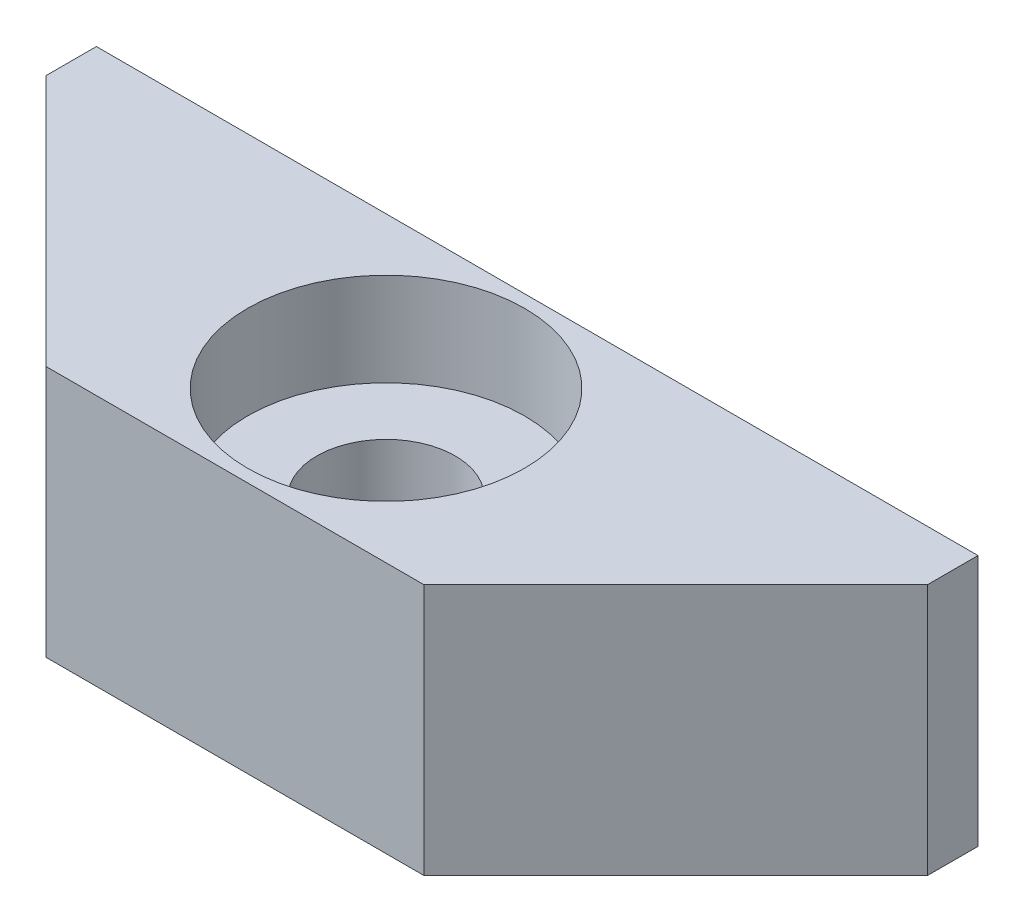
ISO-10303-21;
HEADER;
FILE_DESCRIPTION(('STEP AP214'),'2;1');
FILE_NAME('part.step','',(''),(''),'','','');
FILE_SCHEMA(('AUTOMOTIVE_DESIGN { 1 0 10303 214 1 1 1 1 }'));
ENDSEC;
DATA;
#1=APPLICATION_CONTEXT('core data for automotive mechanical design processes');
#2=APPLICATION_PROTOCOL_DEFINITION('international standard','automotive_design',2000,#1);
#3=PRODUCT_CONTEXT('',#1,'mechanical');
#4=PRODUCT('Part','Part','',(#3));
#5=PRODUCT_RELATED_PRODUCT_CATEGORY('part','',(#4));
#6=PRODUCT_DEFINITION_FORMATION('','',#4);
#7=PRODUCT_DEFINITION_CONTEXT('part definition',#1,'design');
#8=PRODUCT_DEFINITION('design','',#6,#7);
#9=PRODUCT_DEFINITION_SHAPE('','',#8);
#10=(LENGTH_UNIT() NAMED_UNIT(*) SI_UNIT(.MILLI.,.METRE.));
#11=(NAMED_UNIT(*) PLANE_ANGLE_UNIT() SI_UNIT($,.RADIAN.));
#12=(NAMED_UNIT(*) SI_UNIT($,.STERADIAN.) SOLID_ANGLE_UNIT());
#13=UNCERTAINTY_MEASURE_WITH_UNIT(LENGTH_MEASURE(1.E-05),#10,'distance_accuracy_value','');
#14=(GEOMETRIC_REPRESENTATION_CONTEXT(3) GLOBAL_UNCERTAINTY_ASSIGNED_CONTEXT((#13)) GLOBAL_UNIT_ASSIGNED_CONTEXT((#10,
#11,#12)) REPRESENTATION_CONTEXT('',''));
#15=CARTESIAN_POINT('',(0.,0.,0.));
#16=DIRECTION('',(0.,0.,1.));
#17=DIRECTION('',(1.,0.,0.));
#18=AXIS2_PLACEMENT_3D('',#15,#16,#17);
#19=CARTESIAN_POINT('',(0.,10.,0.));
#20=DIRECTION('',(0.,1.,0.));
#21=DIRECTION('',(0.,0.,1.));
#22=AXIS2_PLACEMENT_3D('',#19,#20,#21);
#23=CYLINDRICAL_SURFACE('',#22,2.75);
#24=CARTESIAN_POINT('',(0.,6.3,0.));
#25=DIRECTION('',(0.,1.,0.));
#26=DIRECTION('',(0.,0.,1.));
#27=AXIS2_PLACEMENT_3D('',#24,#25,#26);
#28=CIRCLE('',#27,2.75);
#29=CARTESIAN_POINT('',(0.,6.3,2.75));
#30=VERTEX_POINT('',#29);
#31=EDGE_CURVE('E110',#30,#30,#28,.T.);
#32=ORIENTED_EDGE('',*,*,#31,.T.);
#33=EDGE_LOOP('',(#32));
#34=FACE_BOUND('',#33,.T.);
#35=CARTESIAN_POINT('',(0.,3.,0.));
#36=DIRECTION('',(0.,-1.,0.));
#37=DIRECTION('',(0.,0.,-1.));
#38=AXIS2_PLACEMENT_3D('',#35,#36,#37);
#39=CIRCLE('',#38,2.75);
#40=CARTESIAN_POINT('',(0.,3.,-2.75));
#41=VERTEX_POINT('',#40);
#42=EDGE_CURVE('E101',#41,#41,#39,.F.);
#43=ORIENTED_EDGE('',*,*,#42,.F.);
#44=EDGE_LOOP('',(#43));
#45=FACE_BOUND('',#44,.T.);
#46=ADVANCED_FACE('F17',(#34,#45),#23,.F.);
#47=CARTESIAN_POINT('',(17.5,10.,6.));
#48=DIRECTION('',(-1.,0.,0.));
#49=DIRECTION('',(0.,0.,1.));
#50=AXIS2_PLACEMENT_3D('',#47,#48,#49);
#51=PLANE('',#50);
#52=DIRECTION('',(0.,0.,-1.));
#53=VECTOR('',#52,1.);
#54=CARTESIAN_POINT('',(17.5,10.,6.));
#55=LINE('',#54,#53);
#56=CARTESIAN_POINT('',(17.5,10.,-4.));
#57=VERTEX_POINT('',#56);
#58=CARTESIAN_POINT('',(17.5,10.,-6.));
#59=VERTEX_POINT('',#58);
#60=EDGE_CURVE('E114',#57,#59,#55,.T.);
#61=ORIENTED_EDGE('',*,*,#60,.F.);
#62=DIRECTION('',(0.,-1.,0.));
#63=VECTOR('',#62,1.);
#64=CARTESIAN_POINT('',(17.5,10.,-4.));
#65=LINE('',#64,#63);
#66=CARTESIAN_POINT('',(17.5,0.,-4.));
#67=VERTEX_POINT('',#66);
#68=EDGE_CURVE('E135',#57,#67,#65,.T.);
#69=ORIENTED_EDGE('',*,*,#68,.T.);
#70=DIRECTION('',(0.,0.,-1.));
#71=VECTOR('',#70,1.);
#72=CARTESIAN_POINT('',(17.5,0.,6.));
#73=LINE('',#72,#71);
#74=CARTESIAN_POINT('',(17.5,0.,-6.));
#75=VERTEX_POINT('',#74);
#76=EDGE_CURVE('E113',#67,#75,#73,.T.);
#77=ORIENTED_EDGE('',*,*,#76,.T.);
#78=DIRECTION('',(0.,-1.,0.));
#79=VECTOR('',#78,1.);
#80=CARTESIAN_POINT('',(17.5,10.,-6.));
#81=LINE('',#80,#79);
#82=EDGE_CURVE('E132',#59,#75,#81,.T.);
#83=ORIENTED_EDGE('',*,*,#82,.F.);
#84=EDGE_LOOP('',(#61,#69,#77,#83));
#85=FACE_BOUND('',#84,.T.);
#86=ADVANCED_FACE('F158',(#85),#51,.F.);
#87=CARTESIAN_POINT('',(-17.5,10.,-6.));
#88=DIRECTION('',(0.,0.,1.));
#89=DIRECTION('',(1.,0.,0.));
#90=AXIS2_PLACEMENT_3D('',#87,#88,#89);
#91=PLANE('',#90);
#92=CARTESIAN_POINT('',(12.5,5.,-6.));
#93=DIRECTION('',(0.,0.,-1.));
#94=DIRECTION('',(-1.,0.,0.));
#95=AXIS2_PLACEMENT_3D('',#92,#93,#94);
#96=CIRCLE('',#95,1.65);
#97=CARTESIAN_POINT('',(10.85,5.,-6.));
#98=VERTEX_POINT('',#97);
#99=EDGE_CURVE('E87',#98,#98,#96,.T.);
#100=ORIENTED_EDGE('',*,*,#99,.F.);
#101=EDGE_LOOP('',(#100));
#102=FACE_BOUND('',#101,.T.);
#103=CARTESIAN_POINT('',(-12.5,5.,-6.));
#104=DIRECTION('',(0.,0.,-1.));
#105=DIRECTION('',(-1.,0.,0.));
#106=AXIS2_PLACEMENT_3D('',#103,#104,#105);
#107=CIRCLE('',#106,1.65);
#108=CARTESIAN_POINT('',(-14.15,5.,-6.));
#109=VERTEX_POINT('',#108);
#110=EDGE_CURVE('E86',#109,#109,#107,.T.);
#111=ORIENTED_EDGE('',*,*,#110,.F.);
#112=EDGE_LOOP('',(#111));
#113=FACE_BOUND('',#112,.T.);
#114=DIRECTION('',(-1.,0.,0.));
#115=VECTOR('',#114,1.);
#116=CARTESIAN_POINT('',(-17.5,0.,-6.));
#117=LINE('',#116,#115);
#118=CARTESIAN_POINT('',(-17.5,0.,-6.));
#119=VERTEX_POINT('',#118);
#120=EDGE_CURVE('E125',#75,#119,#117,.T.);
#121=ORIENTED_EDGE('',*,*,#120,.T.);
#122=DIRECTION('',(0.,-1.,0.));
#123=VECTOR('',#122,1.);
#124=CARTESIAN_POINT('',(-17.5,10.,-6.));
#125=LINE('',#124,#123);
#126=CARTESIAN_POINT('',(-17.5,10.,-6.));
#127=VERTEX_POINT('',#126);
#128=EDGE_CURVE('E123',#127,#119,#125,.T.);
#129=ORIENTED_EDGE('',*,*,#128,.F.);
#130=DIRECTION('',(-1.,0.,0.));
#131=VECTOR('',#130,1.);
#132=CARTESIAN_POINT('',(-17.5,10.,-6.));
#133=LINE('',#132,#131);
#134=EDGE_CURVE('E116',#59,#127,#133,.T.);
#135=ORIENTED_EDGE('',*,*,#134,.F.);
#136=ORIENTED_EDGE('',*,*,#82,.T.);
#137=EDGE_LOOP('',(#121,#129,#135,#136));
#138=FACE_BOUND('',#137,.T.);
#139=ADVANCED_FACE('F173',(#102,#113,#138),#91,.F.);
#140=CARTESIAN_POINT('',(-17.5,10.,6.));
#141=DIRECTION('',(1.,0.,0.));
#142=DIRECTION('',(0.,0.,-1.));
#143=AXIS2_PLACEMENT_3D('',#140,#141,#142);
#144=PLANE('',#143);
#145=DIRECTION('',(0.,0.,1.));
#146=VECTOR('',#145,1.);
#147=CARTESIAN_POINT('',(-17.5,0.,6.));
#148=LINE('',#147,#146);
#149=CARTESIAN_POINT('',(-17.5,0.,-4.00000000000005));
#150=VERTEX_POINT('',#149);
#151=EDGE_CURVE('E127',#119,#150,#148,.T.);
#152=ORIENTED_EDGE('',*,*,#151,.T.);
#153=DIRECTION('',(0.,1.,0.));
#154=VECTOR('',#153,1.);
#155=CARTESIAN_POINT('',(-17.5,10.,-4.00000000000005));
#156=LINE('',#155,#154);
#157=CARTESIAN_POINT('',(-17.5,10.,-4.00000000000005));
#158=VERTEX_POINT('',#157);
#159=EDGE_CURVE('E11',#150,#158,#156,.T.);
#160=ORIENTED_EDGE('',*,*,#159,.T.);
#161=DIRECTION('',(0.,0.,1.));
#162=VECTOR('',#161,1.);
#163=CARTESIAN_POINT('',(-17.5,10.,6.));
#164=LINE('',#163,#162);
#165=EDGE_CURVE('E119',#127,#158,#164,.T.);
#166=ORIENTED_EDGE('',*,*,#165,.F.);
#167=ORIENTED_EDGE('',*,*,#128,.T.);
#168=EDGE_LOOP('',(#152,#160,#166,#167));
#169=FACE_BOUND('',#168,.T.);
#170=ADVANCED_FACE('F170',(#169),#144,.F.);
#171=CARTESIAN_POINT('',(-17.5,10.,6.));
#172=DIRECTION('',(0.,0.,-1.));
#173=DIRECTION('',(-1.,0.,0.));
#174=AXIS2_PLACEMENT_3D('',#171,#172,#173);
#175=PLANE('',#174);
#176=DIRECTION('',(1.,0.,0.));
#177=VECTOR('',#176,1.);
#178=CARTESIAN_POINT('',(-17.5,0.,6.));
#179=LINE('',#178,#177);
#180=CARTESIAN_POINT('',(-7.5,0.,6.));
#181=VERTEX_POINT('',#180);
#182=CARTESIAN_POINT('',(7.5,0.,6.));
#183=VERTEX_POINT('',#182);
#184=EDGE_CURVE('E117',#181,#183,#179,.T.);
#185=ORIENTED_EDGE('',*,*,#184,.T.);
#186=DIRECTION('',(0.,1.,0.));
#187=VECTOR('',#186,1.);
#188=CARTESIAN_POINT('',(7.5,10.,6.));
#189=LINE('',#188,#187);
#190=CARTESIAN_POINT('',(7.5,10.,6.));
#191=VERTEX_POINT('',#190);
#192=EDGE_CURVE('E38',#183,#191,#189,.T.);
#193=ORIENTED_EDGE('',*,*,#192,.T.);
#194=DIRECTION('',(1.,0.,0.));
#195=VECTOR('',#194,1.);
#196=CARTESIAN_POINT('',(-17.5,10.,6.));
#197=LINE('',#196,#195);
#198=CARTESIAN_POINT('',(-7.5,10.,6.));
#199=VERTEX_POINT('',#198);
#200=EDGE_CURVE('E121',#199,#191,#197,.T.);
#201=ORIENTED_EDGE('',*,*,#200,.F.);
#202=DIRECTION('',(0.,-1.,0.));
#203=VECTOR('',#202,1.);
#204=CARTESIAN_POINT('',(-7.5,10.,6.));
#205=LINE('',#204,#203);
#206=EDGE_CURVE('E144',#199,#181,#205,.T.);
#207=ORIENTED_EDGE('',*,*,#206,.T.);
#208=EDGE_LOOP('',(#185,#193,#201,#207));
#209=FACE_BOUND('',#208,.T.);
#210=ADVANCED_FACE('F165',(#209),#175,.F.);
#211=CARTESIAN_POINT('',(17.5,10.,-6.));
#212=DIRECTION('',(0.,-1.,0.));
#213=DIRECTION('',(0.,0.,-1.));
#214=AXIS2_PLACEMENT_3D('',#211,#212,#213);
#215=PLANE('',#214);
#216=CARTESIAN_POINT('',(0.,10.,0.));
#217=DIRECTION('',(0.,1.,0.));
#218=DIRECTION('',(0.,0.,1.));
#219=AXIS2_PLACEMENT_3D('',#216,#217,#218);
#220=CIRCLE('',#219,5.5);
#221=CARTESIAN_POINT('',(0.,10.,5.5));
#222=VERTEX_POINT('',#221);
#223=EDGE_CURVE('E104',#222,#222,#220,.T.);
#224=ORIENTED_EDGE('',*,*,#223,.F.);
#225=EDGE_LOOP('',(#224));
#226=FACE_BOUND('',#225,.T.);
#227=ORIENTED_EDGE('',*,*,#200,.T.);
#228=DIRECTION('',(-0.707106781186549,0.,0.707106781186547));
#229=VECTOR('',#228,1.);
#230=CARTESIAN_POINT('',(17.5,10.,-4.));
#231=LINE('',#230,#229);
#232=EDGE_CURVE('E25',#191,#57,#231,.F.);
#233=ORIENTED_EDGE('',*,*,#232,.T.);
#234=ORIENTED_EDGE('',*,*,#60,.T.);
#235=ORIENTED_EDGE('',*,*,#134,.T.);
#236=ORIENTED_EDGE('',*,*,#165,.T.);
#237=DIRECTION('',(-0.707106781186547,0.,-0.707106781186549));
#238=VECTOR('',#237,1.);
#239=CARTESIAN_POINT('',(-7.5,10.,6.));
#240=LINE('',#239,#238);
#241=EDGE_CURVE('E148',#158,#199,#240,.F.);
#242=ORIENTED_EDGE('',*,*,#241,.T.);
#243=EDGE_LOOP('',(#227,#233,#234,#235,#236,#242));
#244=FACE_BOUND('',#243,.T.);
#245=ADVANCED_FACE('F152',(#226,#244),#215,.F.);
#246=CARTESIAN_POINT('',(17.5,0.,-6.));
#247=DIRECTION('',(0.,-1.,0.));
#248=DIRECTION('',(0.,0.,-1.));
#249=AXIS2_PLACEMENT_3D('',#246,#247,#248);
#250=PLANE('',#249);
#251=CARTESIAN_POINT('',(0.,0.,0.));
#252=DIRECTION('',(0.,-1.,0.));
#253=DIRECTION('',(0.,0.,-1.));
#254=AXIS2_PLACEMENT_3D('',#251,#252,#253);
#255=CIRCLE('',#254,4.);
#256=CARTESIAN_POINT('',(0.,0.,-4.));
#257=VERTEX_POINT('',#256);
#258=EDGE_CURVE('E97',#257,#257,#255,.T.);
#259=ORIENTED_EDGE('',*,*,#258,.F.);
#260=EDGE_LOOP('',(#259));
#261=FACE_BOUND('',#260,.T.);
#262=ORIENTED_EDGE('',*,*,#76,.F.);
#263=DIRECTION('',(0.707106781186549,0.,-0.707106781186547));
#264=VECTOR('',#263,1.);
#265=CARTESIAN_POINT('',(18.5,0.,-5.));
#266=LINE('',#265,#264);
#267=EDGE_CURVE('E142',#67,#183,#266,.F.);
#268=ORIENTED_EDGE('',*,*,#267,.T.);
#269=ORIENTED_EDGE('',*,*,#184,.F.);
#270=DIRECTION('',(0.707106781186547,0.,0.707106781186549));
#271=VECTOR('',#270,1.);
#272=CARTESIAN_POINT('',(-1.00000000000001,0.,12.5));
#273=LINE('',#272,#271);
#274=EDGE_CURVE('E140',#181,#150,#273,.F.);
#275=ORIENTED_EDGE('',*,*,#274,.T.);
#276=ORIENTED_EDGE('',*,*,#151,.F.);
#277=ORIENTED_EDGE('',*,*,#120,.F.);
#278=EDGE_LOOP('',(#262,#268,#269,#275,#276,#277));
#279=FACE_BOUND('',#278,.T.);
#280=ADVANCED_FACE('F163',(#261,#279),#250,.T.);
#281=CARTESIAN_POINT('',(2.75,6.3,0.));
#282=DIRECTION('',(0.,-1.,0.));
#283=DIRECTION('',(0.,0.,-1.));
#284=AXIS2_PLACEMENT_3D('',#281,#282,#283);
#285=PLANE('',#284);
#286=ORIENTED_EDGE('',*,*,#31,.F.);
#287=EDGE_LOOP('',(#286));
#288=FACE_BOUND('',#287,.T.);
#289=CARTESIAN_POINT('',(0.,6.3,0.));
#290=DIRECTION('',(0.,1.,0.));
#291=DIRECTION('',(0.,0.,1.));
#292=AXIS2_PLACEMENT_3D('',#289,#290,#291);
#293=CIRCLE('',#292,5.5);
#294=CARTESIAN_POINT('',(0.,6.3,5.5));
#295=VERTEX_POINT('',#294);
#296=EDGE_CURVE('E107',#295,#295,#293,.T.);
#297=ORIENTED_EDGE('',*,*,#296,.T.);
#298=EDGE_LOOP('',(#297));
#299=FACE_BOUND('',#298,.T.);
#300=ADVANCED_FACE('F196',(#288,#299),#285,.F.);
#301=CARTESIAN_POINT('',(0.,10.,0.));
#302=DIRECTION('',(0.,1.,0.));
#303=DIRECTION('',(0.,0.,1.));
#304=AXIS2_PLACEMENT_3D('',#301,#302,#303);
#305=CYLINDRICAL_SURFACE('',#304,5.5);
#306=ORIENTED_EDGE('',*,*,#296,.F.);
#307=EDGE_LOOP('',(#306));
#308=FACE_BOUND('',#307,.T.);
#309=ORIENTED_EDGE('',*,*,#223,.T.);
#310=EDGE_LOOP('',(#309));
#311=FACE_BOUND('',#310,.T.);
#312=ADVANCED_FACE('F231',(#308,#311),#305,.F.);
#313=CARTESIAN_POINT('',(0.,3.,0.));
#314=DIRECTION('',(0.,-1.,0.));
#315=DIRECTION('',(0.,0.,-1.));
#316=AXIS2_PLACEMENT_3D('',#313,#314,#315);
#317=PLANE('',#316);
#318=CARTESIAN_POINT('',(0.,3.,0.));
#319=DIRECTION('',(0.,-1.,0.));
#320=DIRECTION('',(0.,0.,-1.));
#321=AXIS2_PLACEMENT_3D('',#318,#319,#320);
#322=CIRCLE('',#321,4.);
#323=CARTESIAN_POINT('',(0.,3.,-4.));
#324=VERTEX_POINT('',#323);
#325=EDGE_CURVE('E98',#324,#324,#322,.T.);
#326=ORIENTED_EDGE('',*,*,#325,.T.);
#327=EDGE_LOOP('',(#326));
#328=FACE_BOUND('',#327,.T.);
#329=ORIENTED_EDGE('',*,*,#42,.T.);
#330=EDGE_LOOP('',(#329));
#331=FACE_BOUND('',#330,.T.);
#332=ADVANCED_FACE('F239',(#328,#331),#317,.T.);
#333=CARTESIAN_POINT('',(0.,3.,0.));
#334=DIRECTION('',(0.,-1.,0.));
#335=DIRECTION('',(0.,0.,-1.));
#336=AXIS2_PLACEMENT_3D('',#333,#334,#335);
#337=CYLINDRICAL_SURFACE('',#336,4.);
#338=ORIENTED_EDGE('',*,*,#325,.F.);
#339=EDGE_LOOP('',(#338));
#340=FACE_BOUND('',#339,.T.);
#341=ORIENTED_EDGE('',*,*,#258,.T.);
#342=EDGE_LOOP('',(#341));
#343=FACE_BOUND('',#342,.T.);
#344=ADVANCED_FACE('F247',(#340,#343),#337,.F.);
#345=CARTESIAN_POINT('',(17.5,10.,-4.));
#346=DIRECTION('',(-0.707106781186547,0.,-0.707106781186549));
#347=DIRECTION('',(-0.707106781186549,0.,0.707106781186547));
#348=AXIS2_PLACEMENT_3D('',#345,#346,#347);
#349=PLANE('',#348);
#350=ORIENTED_EDGE('',*,*,#232,.F.);
#351=ORIENTED_EDGE('',*,*,#192,.F.);
#352=ORIENTED_EDGE('',*,*,#267,.F.);
#353=ORIENTED_EDGE('',*,*,#68,.F.);
#354=EDGE_LOOP('',(#350,#351,#352,#353));
#355=FACE_BOUND('',#354,.T.);
#356=ADVANCED_FACE('F160',(#355),#349,.F.);
#357=CARTESIAN_POINT('',(-7.5,10.,6.));
#358=DIRECTION('',(0.707106781186549,0.,-0.707106781186547));
#359=DIRECTION('',(-0.707106781186547,0.,-0.707106781186549));
#360=AXIS2_PLACEMENT_3D('',#357,#358,#359);
#361=PLANE('',#360);
#362=ORIENTED_EDGE('',*,*,#241,.F.);
#363=ORIENTED_EDGE('',*,*,#159,.F.);
#364=ORIENTED_EDGE('',*,*,#274,.F.);
#365=ORIENTED_EDGE('',*,*,#206,.F.);
#366=EDGE_LOOP('',(#362,#363,#364,#365));
#367=FACE_BOUND('',#366,.T.);
#368=ADVANCED_FACE('F19',(#367),#361,.F.);
#369=CARTESIAN_POINT('',(-12.5,5.,-1.));
#370=DIRECTION('',(0.,0.,-1.));
#371=DIRECTION('',(-1.,0.,0.));
#372=AXIS2_PLACEMENT_3D('',#369,#370,#371);
#373=CONICAL_SURFACE('',#372,1.65,1.02974425867665);
#374=CARTESIAN_POINT('',(-12.5,5.,-0.00857997860453062));
#375=VERTEX_POINT('',#374);
#376=VERTEX_LOOP('',#375);
#377=FACE_BOUND('',#376,.T.);
#378=CARTESIAN_POINT('',(-12.5,5.,-1.));
#379=DIRECTION('',(0.,0.,-1.));
#380=DIRECTION('',(-1.,0.,0.));
#381=AXIS2_PLACEMENT_3D('',#378,#379,#380);
#382=CIRCLE('',#381,1.65);
#383=CARTESIAN_POINT('',(-14.15,5.,-1.));
#384=VERTEX_POINT('',#383);
#385=EDGE_CURVE('E90',#384,#384,#382,.T.);
#386=ORIENTED_EDGE('',*,*,#385,.T.);
#387=EDGE_LOOP('',(#386));
#388=FACE_BOUND('',#387,.T.);
#389=ADVANCED_FACE('F270',(#377,#388),#373,.F.);
#390=CARTESIAN_POINT('',(-12.5,5.,-6.));
#391=DIRECTION('',(0.,0.,-1.));
#392=DIRECTION('',(-1.,0.,0.));
#393=AXIS2_PLACEMENT_3D('',#390,#391,#392);
#394=CYLINDRICAL_SURFACE('',#393,1.65);
#395=ORIENTED_EDGE('',*,*,#385,.F.);
#396=EDGE_LOOP('',(#395));
#397=FACE_BOUND('',#396,.T.);
#398=ORIENTED_EDGE('',*,*,#110,.T.);
#399=EDGE_LOOP('',(#398));
#400=FACE_BOUND('',#399,.T.);
#401=ADVANCED_FACE('F80',(#397,#400),#394,.F.);
#402=CARTESIAN_POINT('',(12.5,5.,-1.));
#403=DIRECTION('',(0.,0.,-1.));
#404=DIRECTION('',(-1.,0.,0.));
#405=AXIS2_PLACEMENT_3D('',#402,#403,#404);
#406=CONICAL_SURFACE('',#405,1.65,1.02974425867665);
#407=CARTESIAN_POINT('',(12.5,5.,-0.00857997860453062));
#408=VERTEX_POINT('',#407);
#409=VERTEX_LOOP('',#408);
#410=FACE_BOUND('',#409,.T.);
#411=CARTESIAN_POINT('',(12.5,5.,-1.));
#412=DIRECTION('',(0.,0.,-1.));
#413=DIRECTION('',(-1.,0.,0.));
#414=AXIS2_PLACEMENT_3D('',#411,#412,#413);
#415=CIRCLE('',#414,1.65);
#416=CARTESIAN_POINT('',(10.85,5.,-1.));
#417=VERTEX_POINT('',#416);
#418=EDGE_CURVE('E84',#417,#417,#415,.T.);
#419=ORIENTED_EDGE('',*,*,#418,.T.);
#420=EDGE_LOOP('',(#419));
#421=FACE_BOUND('',#420,.T.);
#422=ADVANCED_FACE('F76',(#410,#421),#406,.F.);
#423=CARTESIAN_POINT('',(12.5,5.,-6.));
#424=DIRECTION('',(0.,0.,-1.));
#425=DIRECTION('',(-1.,0.,0.));
#426=AXIS2_PLACEMENT_3D('',#423,#424,#425);
#427=CYLINDRICAL_SURFACE('',#426,1.65);
#428=ORIENTED_EDGE('',*,*,#418,.F.);
#429=EDGE_LOOP('',(#428));
#430=FACE_BOUND('',#429,.T.);
#431=ORIENTED_EDGE('',*,*,#99,.T.);
#432=EDGE_LOOP('',(#431));
#433=FACE_BOUND('',#432,.T.);
#434=ADVANCED_FACE('F79',(#430,#433),#427,.F.);
#435=CLOSED_SHELL('',(#46,#86,#139,#170,#210,#245,#280,#300,#312,#332,#344,#356,#368,#389,#401,
#422,#434));
#436=MANIFOLD_SOLID_BREP('B1',#435);
#437=ADVANCED_BREP_SHAPE_REPRESENTATION('',(#18,#436),#14);
#438=SHAPE_DEFINITION_REPRESENTATION(#9,#437);
ENDSEC;
END-ISO-10303-21;
